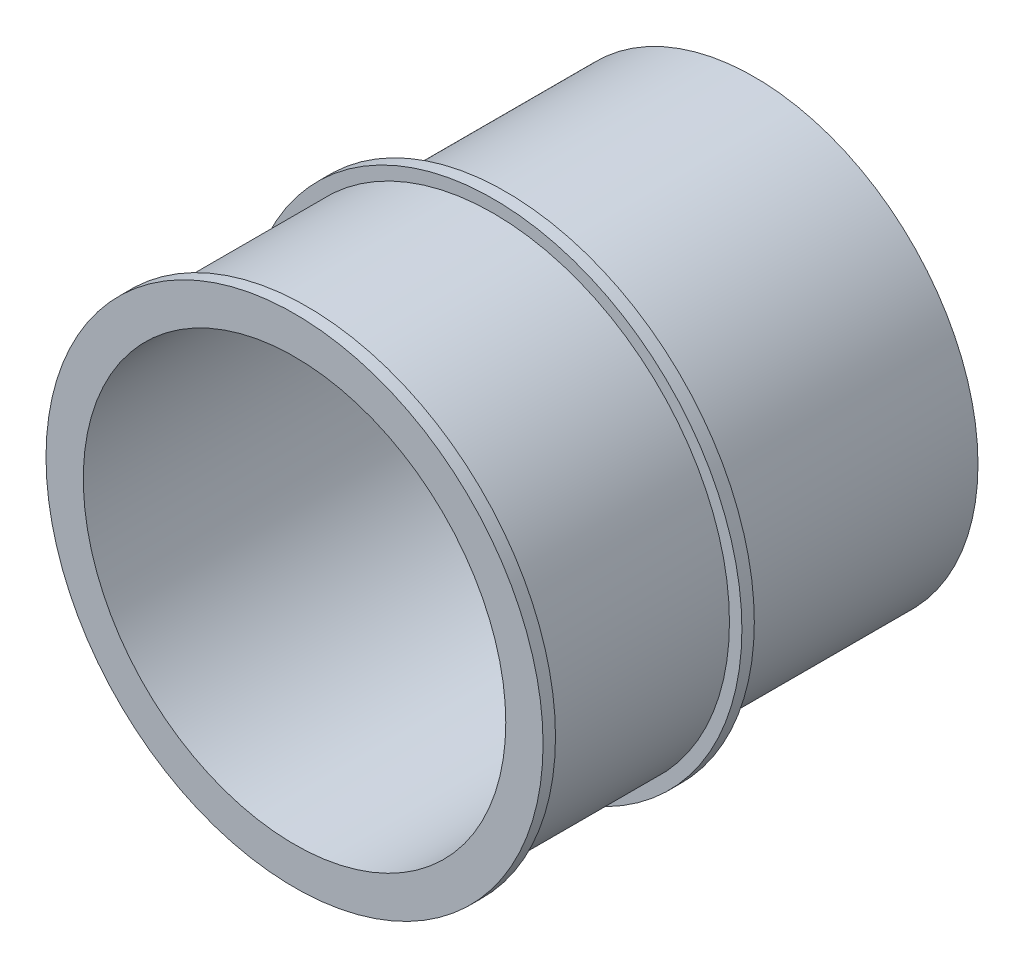
ISO-10303-21;
HEADER;
FILE_DESCRIPTION(('STEP AP214'),'2;1');
FILE_NAME('part.step','',(''),(''),'','','');
FILE_SCHEMA(('AUTOMOTIVE_DESIGN { 1 0 10303 214 1 1 1 1 }'));
ENDSEC;
DATA;
#1=APPLICATION_CONTEXT('core data for automotive mechanical design processes');
#2=APPLICATION_PROTOCOL_DEFINITION('international standard','automotive_design',2000,#1);
#3=PRODUCT_CONTEXT('',#1,'mechanical');
#4=PRODUCT('Part','Part','',(#3));
#5=PRODUCT_RELATED_PRODUCT_CATEGORY('part','',(#4));
#6=PRODUCT_DEFINITION_FORMATION('','',#4);
#7=PRODUCT_DEFINITION_CONTEXT('part definition',#1,'design');
#8=PRODUCT_DEFINITION('design','',#6,#7);
#9=PRODUCT_DEFINITION_SHAPE('','',#8);
#10=(LENGTH_UNIT() NAMED_UNIT(*) SI_UNIT(.MILLI.,.METRE.));
#11=(NAMED_UNIT(*) PLANE_ANGLE_UNIT() SI_UNIT($,.RADIAN.));
#12=(NAMED_UNIT(*) SI_UNIT($,.STERADIAN.) SOLID_ANGLE_UNIT());
#13=UNCERTAINTY_MEASURE_WITH_UNIT(LENGTH_MEASURE(1.E-05),#10,'distance_accuracy_value','');
#14=(GEOMETRIC_REPRESENTATION_CONTEXT(3) GLOBAL_UNCERTAINTY_ASSIGNED_CONTEXT((#13)) GLOBAL_UNIT_ASSIGNED_CONTEXT((#10,
#11,#12)) REPRESENTATION_CONTEXT('',''));
#15=CARTESIAN_POINT('',(0.,0.,0.));
#16=DIRECTION('',(0.,0.,1.));
#17=DIRECTION('',(1.,0.,0.));
#18=AXIS2_PLACEMENT_3D('',#15,#16,#17);
#19=CARTESIAN_POINT('',(0.,0.,34.));
#20=DIRECTION('',(0.,0.,-1.));
#21=DIRECTION('',(-1.,0.,0.));
#22=AXIS2_PLACEMENT_3D('',#19,#20,#21);
#23=CYLINDRICAL_SURFACE('',#22,38.);
#24=CARTESIAN_POINT('',(0.,0.,2.));
#25=DIRECTION('',(0.,0.,1.));
#26=DIRECTION('',(1.,0.,0.));
#27=AXIS2_PLACEMENT_3D('',#24,#25,#26);
#28=CIRCLE('',#27,38.);
#29=CARTESIAN_POINT('',(38.,0.,2.));
#30=VERTEX_POINT('',#29);
#31=EDGE_CURVE('E191',#30,#30,#28,.T.);
#32=ORIENTED_EDGE('',*,*,#31,.T.);
#33=EDGE_LOOP('',(#32));
#34=FACE_BOUND('',#33,.T.);
#35=CARTESIAN_POINT('',(0.,0.,32.));
#36=DIRECTION('',(0.,0.,1.));
#37=DIRECTION('',(1.,0.,0.));
#38=AXIS2_PLACEMENT_3D('',#35,#36,#37);
#39=CIRCLE('',#38,38.);
#40=CARTESIAN_POINT('',(38.,0.,32.));
#41=VERTEX_POINT('',#40);
#42=EDGE_CURVE('E47',#41,#41,#39,.T.);
#43=ORIENTED_EDGE('',*,*,#42,.F.);
#44=EDGE_LOOP('',(#43));
#45=FACE_BOUND('',#44,.T.);
#46=ADVANCED_FACE('F40',(#34,#45),#23,.T.);
#47=CARTESIAN_POINT('',(0.,0.,34.));
#48=DIRECTION('',(0.,0.,1.));
#49=DIRECTION('',(1.,0.,0.));
#50=AXIS2_PLACEMENT_3D('',#47,#48,#49);
#51=PLANE('',#50);
#52=CARTESIAN_POINT('',(0.,0.,34.));
#53=DIRECTION('',(0.,0.,1.));
#54=DIRECTION('',(1.,0.,0.));
#55=AXIS2_PLACEMENT_3D('',#52,#53,#54);
#56=CIRCLE('',#55,40.);
#57=CARTESIAN_POINT('',(40.,0.,34.));
#58=VERTEX_POINT('',#57);
#59=EDGE_CURVE('E198',#58,#58,#56,.T.);
#60=ORIENTED_EDGE('',*,*,#59,.T.);
#61=EDGE_LOOP('',(#60));
#62=FACE_BOUND('',#61,.T.);
#63=CARTESIAN_POINT('',(0.,0.,34.));
#64=DIRECTION('',(0.,0.,1.));
#65=DIRECTION('',(1.,0.,0.));
#66=AXIS2_PLACEMENT_3D('',#63,#64,#65);
#67=CIRCLE('',#66,34.);
#68=CARTESIAN_POINT('',(34.,0.,34.));
#69=VERTEX_POINT('',#68);
#70=EDGE_CURVE('E188',#69,#69,#67,.F.);
#71=ORIENTED_EDGE('',*,*,#70,.T.);
#72=EDGE_LOOP('',(#71));
#73=FACE_BOUND('',#72,.T.);
#74=ADVANCED_FACE('F212',(#62,#73),#51,.T.);
#75=CARTESIAN_POINT('',(0.,0.,0.));
#76=DIRECTION('',(0.,0.,1.));
#77=DIRECTION('',(1.,0.,0.));
#78=AXIS2_PLACEMENT_3D('',#75,#76,#77);
#79=PLANE('',#78);
#80=CARTESIAN_POINT('',(0.,0.,0.));
#81=DIRECTION('',(0.,0.,1.));
#82=DIRECTION('',(1.,0.,0.));
#83=AXIS2_PLACEMENT_3D('',#80,#81,#82);
#84=CIRCLE('',#83,36.);
#85=CARTESIAN_POINT('',(36.,0.,0.));
#86=VERTEX_POINT('',#85);
#87=EDGE_CURVE('E11',#86,#86,#84,.F.);
#88=ORIENTED_EDGE('',*,*,#87,.F.);
#89=EDGE_LOOP('',(#88));
#90=FACE_BOUND('',#89,.T.);
#91=CARTESIAN_POINT('',(0.,0.,0.));
#92=DIRECTION('',(0.,0.,1.));
#93=DIRECTION('',(1.,0.,0.));
#94=AXIS2_PLACEMENT_3D('',#91,#92,#93);
#95=CIRCLE('',#94,40.);
#96=CARTESIAN_POINT('',(40.,0.,0.));
#97=VERTEX_POINT('',#96);
#98=EDGE_CURVE('E194',#97,#97,#95,.T.);
#99=ORIENTED_EDGE('',*,*,#98,.F.);
#100=EDGE_LOOP('',(#99));
#101=FACE_BOUND('',#100,.T.);
#102=ADVANCED_FACE('F217',(#90,#101),#79,.F.);
#103=CARTESIAN_POINT('',(0.,0.,32.));
#104=DIRECTION('',(0.,0.,1.));
#105=DIRECTION('',(1.,0.,0.));
#106=AXIS2_PLACEMENT_3D('',#103,#104,#105);
#107=CYLINDRICAL_SURFACE('',#106,40.);
#108=CARTESIAN_POINT('',(0.,0.,32.));
#109=DIRECTION('',(0.,0.,1.));
#110=DIRECTION('',(1.,0.,0.));
#111=AXIS2_PLACEMENT_3D('',#108,#109,#110);
#112=CIRCLE('',#111,40.);
#113=CARTESIAN_POINT('',(40.,0.,32.));
#114=VERTEX_POINT('',#113);
#115=EDGE_CURVE('E201',#114,#114,#112,.T.);
#116=ORIENTED_EDGE('',*,*,#115,.T.);
#117=EDGE_LOOP('',(#116));
#118=FACE_BOUND('',#117,.T.);
#119=ORIENTED_EDGE('',*,*,#59,.F.);
#120=EDGE_LOOP('',(#119));
#121=FACE_BOUND('',#120,.T.);
#122=ADVANCED_FACE('F234',(#118,#121),#107,.T.);
#123=CARTESIAN_POINT('',(0.,0.,32.));
#124=DIRECTION('',(0.,0.,1.));
#125=DIRECTION('',(1.,0.,0.));
#126=AXIS2_PLACEMENT_3D('',#123,#124,#125);
#127=PLANE('',#126);
#128=ORIENTED_EDGE('',*,*,#42,.T.);
#129=EDGE_LOOP('',(#128));
#130=FACE_BOUND('',#129,.T.);
#131=ORIENTED_EDGE('',*,*,#115,.F.);
#132=EDGE_LOOP('',(#131));
#133=FACE_BOUND('',#132,.T.);
#134=ADVANCED_FACE('F208',(#130,#133),#127,.F.);
#135=CARTESIAN_POINT('',(0.,0.,2.));
#136=DIRECTION('',(0.,0.,1.));
#137=DIRECTION('',(1.,0.,0.));
#138=AXIS2_PLACEMENT_3D('',#135,#136,#137);
#139=PLANE('',#138);
#140=CARTESIAN_POINT('',(0.,0.,2.));
#141=DIRECTION('',(0.,0.,1.));
#142=DIRECTION('',(1.,0.,0.));
#143=AXIS2_PLACEMENT_3D('',#140,#141,#142);
#144=CIRCLE('',#143,40.);
#145=CARTESIAN_POINT('',(40.,0.,2.));
#146=VERTEX_POINT('',#145);
#147=EDGE_CURVE('E195',#146,#146,#144,.T.);
#148=ORIENTED_EDGE('',*,*,#147,.T.);
#149=EDGE_LOOP('',(#148));
#150=FACE_BOUND('',#149,.T.);
#151=ORIENTED_EDGE('',*,*,#31,.F.);
#152=EDGE_LOOP('',(#151));
#153=FACE_BOUND('',#152,.T.);
#154=ADVANCED_FACE('F222',(#150,#153),#139,.T.);
#155=CARTESIAN_POINT('',(0.,0.,2.));
#156=DIRECTION('',(0.,0.,-1.));
#157=DIRECTION('',(-1.,0.,0.));
#158=AXIS2_PLACEMENT_3D('',#155,#156,#157);
#159=CYLINDRICAL_SURFACE('',#158,40.);
#160=ORIENTED_EDGE('',*,*,#147,.F.);
#161=EDGE_LOOP('',(#160));
#162=FACE_BOUND('',#161,.T.);
#163=ORIENTED_EDGE('',*,*,#98,.T.);
#164=EDGE_LOOP('',(#163));
#165=FACE_BOUND('',#164,.T.);
#166=ADVANCED_FACE('F224',(#162,#165),#159,.T.);
#167=CARTESIAN_POINT('',(0.,0.,34.));
#168=DIRECTION('',(0.,0.,-1.));
#169=DIRECTION('',(-1.,0.,0.));
#170=AXIS2_PLACEMENT_3D('',#167,#168,#169);
#171=CYLINDRICAL_SURFACE('',#170,34.);
#172=ORIENTED_EDGE('',*,*,#70,.F.);
#173=EDGE_LOOP('',(#172));
#174=FACE_BOUND('',#173,.T.);
#175=CARTESIAN_POINT('',(0.,0.,-28.));
#176=DIRECTION('',(0.,0.,1.));
#177=DIRECTION('',(1.,0.,0.));
#178=AXIS2_PLACEMENT_3D('',#175,#176,#177);
#179=CIRCLE('',#178,34.);
#180=CARTESIAN_POINT('',(34.,0.,-28.));
#181=VERTEX_POINT('',#180);
#182=EDGE_CURVE('E183',#181,#181,#179,.T.);
#183=ORIENTED_EDGE('',*,*,#182,.F.);
#184=EDGE_LOOP('',(#183));
#185=FACE_BOUND('',#184,.T.);
#186=ADVANCED_FACE('F231',(#174,#185),#171,.F.);
#187=CARTESIAN_POINT('',(0.,0.,-28.));
#188=DIRECTION('',(0.,0.,1.));
#189=DIRECTION('',(1.,0.,0.));
#190=AXIS2_PLACEMENT_3D('',#187,#188,#189);
#191=PLANE('',#190);
#192=DIRECTION('',(0.,-1.,0.));
#193=VECTOR('',#192,1.);
#194=CARTESIAN_POINT('',(-10.,-5.,-28.));
#195=LINE('',#194,#193);
#196=CARTESIAN_POINT('',(-10.,5.,-28.));
#197=VERTEX_POINT('',#196);
#198=CARTESIAN_POINT('',(-10.,-5.,-28.));
#199=VERTEX_POINT('',#198);
#200=EDGE_CURVE('E62',#197,#199,#195,.T.);
#201=ORIENTED_EDGE('',*,*,#200,.T.);
#202=DIRECTION('',(1.,0.,0.));
#203=VECTOR('',#202,1.);
#204=CARTESIAN_POINT('',(10.,-5.,-28.));
#205=LINE('',#204,#203);
#206=CARTESIAN_POINT('',(10.,-5.,-28.));
#207=VERTEX_POINT('',#206);
#208=EDGE_CURVE('E133',#199,#207,#205,.T.);
#209=ORIENTED_EDGE('',*,*,#208,.T.);
#210=DIRECTION('',(0.,1.,0.));
#211=VECTOR('',#210,1.);
#212=CARTESIAN_POINT('',(10.,5.,-28.));
#213=LINE('',#212,#211);
#214=CARTESIAN_POINT('',(10.,5.,-28.));
#215=VERTEX_POINT('',#214);
#216=EDGE_CURVE('E135',#207,#215,#213,.T.);
#217=ORIENTED_EDGE('',*,*,#216,.T.);
#218=DIRECTION('',(-1.,0.,0.));
#219=VECTOR('',#218,1.);
#220=CARTESIAN_POINT('',(0.,5.,-28.));
#221=LINE('',#220,#219);
#222=EDGE_CURVE('E116',#215,#197,#221,.T.);
#223=ORIENTED_EDGE('',*,*,#222,.T.);
#224=EDGE_LOOP('',(#201,#209,#217,#223));
#225=FACE_BOUND('',#224,.T.);
#226=ADVANCED_FACE('F278',(#225),#191,.T.);
#227=CARTESIAN_POINT('',(10.,-5.,-18.));
#228=DIRECTION('',(0.,1.,0.));
#229=DIRECTION('',(-1.,0.,0.));
#230=AXIS2_PLACEMENT_3D('',#227,#228,#229);
#231=PLANE('',#230);
#232=ORIENTED_EDGE('',*,*,#208,.F.);
#233=DIRECTION('',(0.,0.,-1.));
#234=VECTOR('',#233,1.);
#235=CARTESIAN_POINT('',(-10.,-5.,-18.));
#236=LINE('',#235,#234);
#237=CARTESIAN_POINT('',(-10.,-5.,-18.));
#238=VERTEX_POINT('',#237);
#239=EDGE_CURVE('E122',#238,#199,#236,.T.);
#240=ORIENTED_EDGE('',*,*,#239,.F.);
#241=DIRECTION('',(1.,0.,0.));
#242=VECTOR('',#241,1.);
#243=CARTESIAN_POINT('',(10.,-5.,-18.));
#244=LINE('',#243,#242);
#245=CARTESIAN_POINT('',(10.,-5.,-18.));
#246=VERTEX_POINT('',#245);
#247=EDGE_CURVE('E126',#238,#246,#244,.T.);
#248=ORIENTED_EDGE('',*,*,#247,.T.);
#249=DIRECTION('',(0.,0.,-1.));
#250=VECTOR('',#249,1.);
#251=CARTESIAN_POINT('',(10.,-5.,-18.));
#252=LINE('',#251,#250);
#253=EDGE_CURVE('E139',#246,#207,#252,.T.);
#254=ORIENTED_EDGE('',*,*,#253,.T.);
#255=EDGE_LOOP('',(#232,#240,#248,#254));
#256=FACE_BOUND('',#255,.T.);
#257=ADVANCED_FACE('F281',(#256),#231,.T.);
#258=CARTESIAN_POINT('',(10.,5.,-18.));
#259=DIRECTION('',(-1.,0.,0.));
#260=DIRECTION('',(0.,-1.,0.));
#261=AXIS2_PLACEMENT_3D('',#258,#259,#260);
#262=PLANE('',#261);
#263=ORIENTED_EDGE('',*,*,#216,.F.);
#264=ORIENTED_EDGE('',*,*,#253,.F.);
#265=DIRECTION('',(0.,1.,0.));
#266=VECTOR('',#265,1.);
#267=CARTESIAN_POINT('',(10.,5.,-18.));
#268=LINE('',#267,#266);
#269=CARTESIAN_POINT('',(10.,5.,-18.));
#270=VERTEX_POINT('',#269);
#271=EDGE_CURVE('E128',#246,#270,#268,.T.);
#272=ORIENTED_EDGE('',*,*,#271,.T.);
#273=DIRECTION('',(0.,0.,-1.));
#274=VECTOR('',#273,1.);
#275=CARTESIAN_POINT('',(10.,5.,-18.));
#276=LINE('',#275,#274);
#277=EDGE_CURVE('E110',#270,#215,#276,.T.);
#278=ORIENTED_EDGE('',*,*,#277,.T.);
#279=EDGE_LOOP('',(#263,#264,#272,#278));
#280=FACE_BOUND('',#279,.T.);
#281=ADVANCED_FACE('F304',(#280),#262,.T.);
#282=CARTESIAN_POINT('',(0.,5.,-18.));
#283=DIRECTION('',(0.,-1.,0.));
#284=DIRECTION('',(0.,0.,-1.));
#285=AXIS2_PLACEMENT_3D('',#282,#283,#284);
#286=PLANE('',#285);
#287=ORIENTED_EDGE('',*,*,#222,.F.);
#288=ORIENTED_EDGE('',*,*,#277,.F.);
#289=DIRECTION('',(-1.,0.,0.));
#290=VECTOR('',#289,1.);
#291=CARTESIAN_POINT('',(-10.,5.,-18.));
#292=LINE('',#291,#290);
#293=CARTESIAN_POINT('',(-10.,5.,-18.));
#294=VERTEX_POINT('',#293);
#295=EDGE_CURVE('E104',#270,#294,#292,.T.);
#296=ORIENTED_EDGE('',*,*,#295,.T.);
#297=DIRECTION('',(0.,0.,-1.));
#298=VECTOR('',#297,1.);
#299=CARTESIAN_POINT('',(-10.,5.,-18.));
#300=LINE('',#299,#298);
#301=EDGE_CURVE('E108',#294,#197,#300,.T.);
#302=ORIENTED_EDGE('',*,*,#301,.T.);
#303=EDGE_LOOP('',(#287,#288,#296,#302));
#304=FACE_BOUND('',#303,.T.);
#305=ADVANCED_FACE('F107',(#304),#286,.T.);
#306=CARTESIAN_POINT('',(-10.,-5.,-18.));
#307=DIRECTION('',(1.,0.,0.));
#308=DIRECTION('',(0.,0.,-1.));
#309=AXIS2_PLACEMENT_3D('',#306,#307,#308);
#310=PLANE('',#309);
#311=ORIENTED_EDGE('',*,*,#200,.F.);
#312=ORIENTED_EDGE('',*,*,#301,.F.);
#313=DIRECTION('',(0.,-1.,0.));
#314=VECTOR('',#313,1.);
#315=CARTESIAN_POINT('',(-10.,-5.,-18.));
#316=LINE('',#315,#314);
#317=EDGE_CURVE('E115',#294,#238,#316,.T.);
#318=ORIENTED_EDGE('',*,*,#317,.T.);
#319=ORIENTED_EDGE('',*,*,#239,.T.);
#320=EDGE_LOOP('',(#311,#312,#318,#319));
#321=FACE_BOUND('',#320,.T.);
#322=ADVANCED_FACE('F119',(#321),#310,.T.);
#323=CARTESIAN_POINT('',(0.,0.,-18.));
#324=DIRECTION('',(0.,0.,-1.));
#325=DIRECTION('',(-1.,0.,0.));
#326=AXIS2_PLACEMENT_3D('',#323,#324,#325);
#327=PLANE('',#326);
#328=DIRECTION('',(-1.,0.,0.));
#329=VECTOR('',#328,1.);
#330=CARTESIAN_POINT('',(-12.,7.,-18.));
#331=LINE('',#330,#329);
#332=CARTESIAN_POINT('',(12.,7.,-18.));
#333=VERTEX_POINT('',#332);
#334=CARTESIAN_POINT('',(-12.,7.,-18.));
#335=VERTEX_POINT('',#334);
#336=EDGE_CURVE('E143',#333,#335,#331,.T.);
#337=ORIENTED_EDGE('',*,*,#336,.T.);
#338=DIRECTION('',(0.,-1.,0.));
#339=VECTOR('',#338,1.);
#340=CARTESIAN_POINT('',(-12.,-7.,-18.));
#341=LINE('',#340,#339);
#342=CARTESIAN_POINT('',(-12.,-7.,-18.));
#343=VERTEX_POINT('',#342);
#344=EDGE_CURVE('E146',#335,#343,#341,.T.);
#345=ORIENTED_EDGE('',*,*,#344,.T.);
#346=DIRECTION('',(1.,0.,0.));
#347=VECTOR('',#346,1.);
#348=CARTESIAN_POINT('',(12.,-7.,-18.));
#349=LINE('',#348,#347);
#350=CARTESIAN_POINT('',(12.,-7.,-18.));
#351=VERTEX_POINT('',#350);
#352=EDGE_CURVE('E149',#343,#351,#349,.T.);
#353=ORIENTED_EDGE('',*,*,#352,.T.);
#354=DIRECTION('',(0.,1.,0.));
#355=VECTOR('',#354,1.);
#356=CARTESIAN_POINT('',(12.,7.,-18.));
#357=LINE('',#356,#355);
#358=EDGE_CURVE('E151',#351,#333,#357,.T.);
#359=ORIENTED_EDGE('',*,*,#358,.T.);
#360=EDGE_LOOP('',(#337,#345,#353,#359));
#361=FACE_BOUND('',#360,.T.);
#362=ORIENTED_EDGE('',*,*,#317,.F.);
#363=ORIENTED_EDGE('',*,*,#295,.F.);
#364=ORIENTED_EDGE('',*,*,#271,.F.);
#365=ORIENTED_EDGE('',*,*,#247,.F.);
#366=EDGE_LOOP('',(#362,#363,#364,#365));
#367=FACE_BOUND('',#366,.T.);
#368=ADVANCED_FACE('F125',(#361,#367),#327,.F.);
#369=CARTESIAN_POINT('',(12.,7.,-18.));
#370=DIRECTION('',(-1.,0.,0.));
#371=DIRECTION('',(0.,0.,1.));
#372=AXIS2_PLACEMENT_3D('',#369,#370,#371);
#373=PLANE('',#372);
#374=DIRECTION('',(0.,1.,0.));
#375=VECTOR('',#374,1.);
#376=CARTESIAN_POINT('',(12.,7.,-28.));
#377=LINE('',#376,#375);
#378=CARTESIAN_POINT('',(12.,-7.,-28.));
#379=VERTEX_POINT('',#378);
#380=CARTESIAN_POINT('',(12.,7.,-28.));
#381=VERTEX_POINT('',#380);
#382=EDGE_CURVE('E157',#379,#381,#377,.T.);
#383=ORIENTED_EDGE('',*,*,#382,.T.);
#384=DIRECTION('',(0.,0.,-1.));
#385=VECTOR('',#384,1.);
#386=CARTESIAN_POINT('',(12.,7.,-18.));
#387=LINE('',#386,#385);
#388=EDGE_CURVE('E54',#333,#381,#387,.T.);
#389=ORIENTED_EDGE('',*,*,#388,.F.);
#390=ORIENTED_EDGE('',*,*,#358,.F.);
#391=DIRECTION('',(0.,0.,-1.));
#392=VECTOR('',#391,1.);
#393=CARTESIAN_POINT('',(12.,-7.,-18.));
#394=LINE('',#393,#392);
#395=EDGE_CURVE('E161',#351,#379,#394,.T.);
#396=ORIENTED_EDGE('',*,*,#395,.T.);
#397=EDGE_LOOP('',(#383,#389,#390,#396));
#398=FACE_BOUND('',#397,.T.);
#399=ADVANCED_FACE('F291',(#398),#373,.F.);
#400=CARTESIAN_POINT('',(0.,7.,-18.));
#401=DIRECTION('',(0.,-1.,0.));
#402=DIRECTION('',(0.,0.,-1.));
#403=AXIS2_PLACEMENT_3D('',#400,#401,#402);
#404=PLANE('',#403);
#405=DIRECTION('',(-1.,0.,0.));
#406=VECTOR('',#405,1.);
#407=CARTESIAN_POINT('',(0.,7.,-28.));
#408=LINE('',#407,#406);
#409=CARTESIAN_POINT('',(-12.,7.,-28.));
#410=VERTEX_POINT('',#409);
#411=EDGE_CURVE('E147',#381,#410,#408,.T.);
#412=ORIENTED_EDGE('',*,*,#411,.T.);
#413=DIRECTION('',(0.,0.,-1.));
#414=VECTOR('',#413,1.);
#415=CARTESIAN_POINT('',(-12.,7.,-18.));
#416=LINE('',#415,#414);
#417=EDGE_CURVE('E167',#335,#410,#416,.T.);
#418=ORIENTED_EDGE('',*,*,#417,.F.);
#419=ORIENTED_EDGE('',*,*,#336,.F.);
#420=ORIENTED_EDGE('',*,*,#388,.T.);
#421=EDGE_LOOP('',(#412,#418,#419,#420));
#422=FACE_BOUND('',#421,.T.);
#423=ADVANCED_FACE('F286',(#422),#404,.F.);
#424=CARTESIAN_POINT('',(-12.,-7.,-18.));
#425=DIRECTION('',(1.,0.,0.));
#426=DIRECTION('',(0.,0.,-1.));
#427=AXIS2_PLACEMENT_3D('',#424,#425,#426);
#428=PLANE('',#427);
#429=DIRECTION('',(0.,-1.,0.));
#430=VECTOR('',#429,1.);
#431=CARTESIAN_POINT('',(-12.,-7.,-28.));
#432=LINE('',#431,#430);
#433=CARTESIAN_POINT('',(-12.,-7.,-28.));
#434=VERTEX_POINT('',#433);
#435=EDGE_CURVE('E121',#410,#434,#432,.T.);
#436=ORIENTED_EDGE('',*,*,#435,.T.);
#437=DIRECTION('',(0.,0.,-1.));
#438=VECTOR('',#437,1.);
#439=CARTESIAN_POINT('',(-12.,-7.,-18.));
#440=LINE('',#439,#438);
#441=EDGE_CURVE('E164',#343,#434,#440,.T.);
#442=ORIENTED_EDGE('',*,*,#441,.F.);
#443=ORIENTED_EDGE('',*,*,#344,.F.);
#444=ORIENTED_EDGE('',*,*,#417,.T.);
#445=EDGE_LOOP('',(#436,#442,#443,#444));
#446=FACE_BOUND('',#445,.T.);
#447=ADVANCED_FACE('F282',(#446),#428,.F.);
#448=CARTESIAN_POINT('',(12.,-7.,-18.));
#449=DIRECTION('',(0.,1.,0.));
#450=DIRECTION('',(0.,0.,1.));
#451=AXIS2_PLACEMENT_3D('',#448,#449,#450);
#452=PLANE('',#451);
#453=DIRECTION('',(1.,0.,0.));
#454=VECTOR('',#453,1.);
#455=CARTESIAN_POINT('',(12.,-7.,-28.));
#456=LINE('',#455,#454);
#457=EDGE_CURVE('E155',#434,#379,#456,.T.);
#458=ORIENTED_EDGE('',*,*,#457,.T.);
#459=ORIENTED_EDGE('',*,*,#395,.F.);
#460=ORIENTED_EDGE('',*,*,#352,.F.);
#461=ORIENTED_EDGE('',*,*,#441,.T.);
#462=EDGE_LOOP('',(#458,#459,#460,#461));
#463=FACE_BOUND('',#462,.T.);
#464=ADVANCED_FACE('F285',(#463),#452,.F.);
#465=ORIENTED_EDGE('',*,*,#182,.T.);
#466=EDGE_LOOP('',(#465));
#467=FACE_BOUND('',#466,.T.);
#468=ORIENTED_EDGE('',*,*,#457,.F.);
#469=ORIENTED_EDGE('',*,*,#435,.F.);
#470=ORIENTED_EDGE('',*,*,#411,.F.);
#471=ORIENTED_EDGE('',*,*,#382,.F.);
#472=EDGE_LOOP('',(#468,#469,#470,#471));
#473=FACE_BOUND('',#472,.T.);
#474=ADVANCED_FACE('F268',(#467,#473),#191,.T.);
#475=CARTESIAN_POINT('',(0.,0.,-40.));
#476=DIRECTION('',(0.,0.,1.));
#477=DIRECTION('',(1.,0.,0.));
#478=AXIS2_PLACEMENT_3D('',#475,#476,#477);
#479=CYLINDRICAL_SURFACE('',#478,34.);
#480=CARTESIAN_POINT('',(0.,0.,-38.));
#481=DIRECTION('',(0.,0.,-1.));
#482=DIRECTION('',(-1.,0.,0.));
#483=AXIS2_PLACEMENT_3D('',#480,#481,#482);
#484=CIRCLE('',#483,34.);
#485=CARTESIAN_POINT('',(-34.,0.,-38.));
#486=VERTEX_POINT('',#485);
#487=EDGE_CURVE('E177',#486,#486,#484,.T.);
#488=ORIENTED_EDGE('',*,*,#487,.T.);
#489=EDGE_LOOP('',(#488));
#490=FACE_BOUND('',#489,.T.);
#491=CARTESIAN_POINT('',(0.,0.,-30.));
#492=DIRECTION('',(0.,0.,1.));
#493=DIRECTION('',(1.,0.,0.));
#494=AXIS2_PLACEMENT_3D('',#491,#492,#493);
#495=CIRCLE('',#494,34.);
#496=CARTESIAN_POINT('',(34.,0.,-30.));
#497=VERTEX_POINT('',#496);
#498=EDGE_CURVE('E170',#497,#497,#495,.T.);
#499=ORIENTED_EDGE('',*,*,#498,.T.);
#500=EDGE_LOOP('',(#499));
#501=FACE_BOUND('',#500,.T.);
#502=ADVANCED_FACE('F262',(#490,#501),#479,.F.);
#503=CARTESIAN_POINT('',(0.,0.,-40.));
#504=DIRECTION('',(0.,0.,-1.));
#505=DIRECTION('',(-1.,0.,0.));
#506=AXIS2_PLACEMENT_3D('',#503,#504,#505);
#507=PLANE('',#506);
#508=CARTESIAN_POINT('',(0.,0.,-40.));
#509=DIRECTION('',(0.,0.,-1.));
#510=DIRECTION('',(-1.,0.,0.));
#511=AXIS2_PLACEMENT_3D('',#508,#509,#510);
#512=CIRCLE('',#511,5.);
#513=CARTESIAN_POINT('',(-5.,0.,-40.));
#514=VERTEX_POINT('',#513);
#515=EDGE_CURVE('E173',#514,#514,#512,.T.);
#516=ORIENTED_EDGE('',*,*,#515,.F.);
#517=EDGE_LOOP('',(#516));
#518=FACE_BOUND('',#517,.T.);
#519=CARTESIAN_POINT('',(0.,0.,-40.));
#520=DIRECTION('',(0.,0.,-1.));
#521=DIRECTION('',(-1.,0.,0.));
#522=AXIS2_PLACEMENT_3D('',#519,#520,#521);
#523=CIRCLE('',#522,36.);
#524=CARTESIAN_POINT('',(-36.,0.,-40.));
#525=VERTEX_POINT('',#524);
#526=EDGE_CURVE('E180',#525,#525,#523,.T.);
#527=ORIENTED_EDGE('',*,*,#526,.T.);
#528=EDGE_LOOP('',(#527));
#529=FACE_BOUND('',#528,.T.);
#530=ADVANCED_FACE('F253',(#518,#529),#507,.T.);
#531=CARTESIAN_POINT('',(0.,0.,-40.));
#532=DIRECTION('',(0.,0.,1.));
#533=DIRECTION('',(1.,0.,0.));
#534=AXIS2_PLACEMENT_3D('',#531,#532,#533);
#535=CYLINDRICAL_SURFACE('',#534,36.);
#536=ORIENTED_EDGE('',*,*,#526,.F.);
#537=EDGE_LOOP('',(#536));
#538=FACE_BOUND('',#537,.T.);
#539=ORIENTED_EDGE('',*,*,#87,.T.);
#540=EDGE_LOOP('',(#539));
#541=FACE_BOUND('',#540,.T.);
#542=ADVANCED_FACE('F250',(#538,#541),#535,.T.);
#543=CARTESIAN_POINT('',(0.,0.,-38.));
#544=DIRECTION('',(0.,0.,-1.));
#545=DIRECTION('',(-1.,0.,0.));
#546=AXIS2_PLACEMENT_3D('',#543,#544,#545);
#547=PLANE('',#546);
#548=CARTESIAN_POINT('',(0.,0.,-38.));
#549=DIRECTION('',(0.,0.,-1.));
#550=DIRECTION('',(-1.,0.,0.));
#551=AXIS2_PLACEMENT_3D('',#548,#549,#550);
#552=CIRCLE('',#551,5.);
#553=CARTESIAN_POINT('',(-5.,0.,-38.));
#554=VERTEX_POINT('',#553);
#555=EDGE_CURVE('E176',#554,#554,#552,.T.);
#556=ORIENTED_EDGE('',*,*,#555,.T.);
#557=EDGE_LOOP('',(#556));
#558=FACE_BOUND('',#557,.T.);
#559=ORIENTED_EDGE('',*,*,#487,.F.);
#560=EDGE_LOOP('',(#559));
#561=FACE_BOUND('',#560,.T.);
#562=ADVANCED_FACE('F252',(#558,#561),#547,.F.);
#563=CARTESIAN_POINT('',(0.,0.,34.));
#564=DIRECTION('',(0.,0.,-1.));
#565=DIRECTION('',(-1.,0.,0.));
#566=AXIS2_PLACEMENT_3D('',#563,#564,#565);
#567=CYLINDRICAL_SURFACE('',#566,5.);
#568=ORIENTED_EDGE('',*,*,#515,.T.);
#569=EDGE_LOOP('',(#568));
#570=FACE_BOUND('',#569,.T.);
#571=ORIENTED_EDGE('',*,*,#555,.F.);
#572=EDGE_LOOP('',(#571));
#573=FACE_BOUND('',#572,.T.);
#574=ADVANCED_FACE('F259',(#570,#573),#567,.F.);
#575=CARTESIAN_POINT('',(0.,0.,-30.));
#576=DIRECTION('',(0.,0.,1.));
#577=DIRECTION('',(1.,0.,0.));
#578=AXIS2_PLACEMENT_3D('',#575,#576,#577);
#579=PLANE('',#578);
#580=ORIENTED_EDGE('',*,*,#498,.F.);
#581=EDGE_LOOP('',(#580));
#582=FACE_BOUND('',#581,.T.);
#583=ADVANCED_FACE('F273',(#582),#579,.F.);
#584=CLOSED_SHELL('',(#46,#74,#102,#122,#134,#154,#166,#186,#226,#257,#281,#305,#322,#368,#399,
#423,#447,#464,#474,#502,#530,#542,#562,#574,#583));
#585=MANIFOLD_SOLID_BREP('B2',#584);
#586=ADVANCED_BREP_SHAPE_REPRESENTATION('',(#18,#585),#14);
#587=SHAPE_DEFINITION_REPRESENTATION(#9,#586);
ENDSEC;
END-ISO-10303-21;
